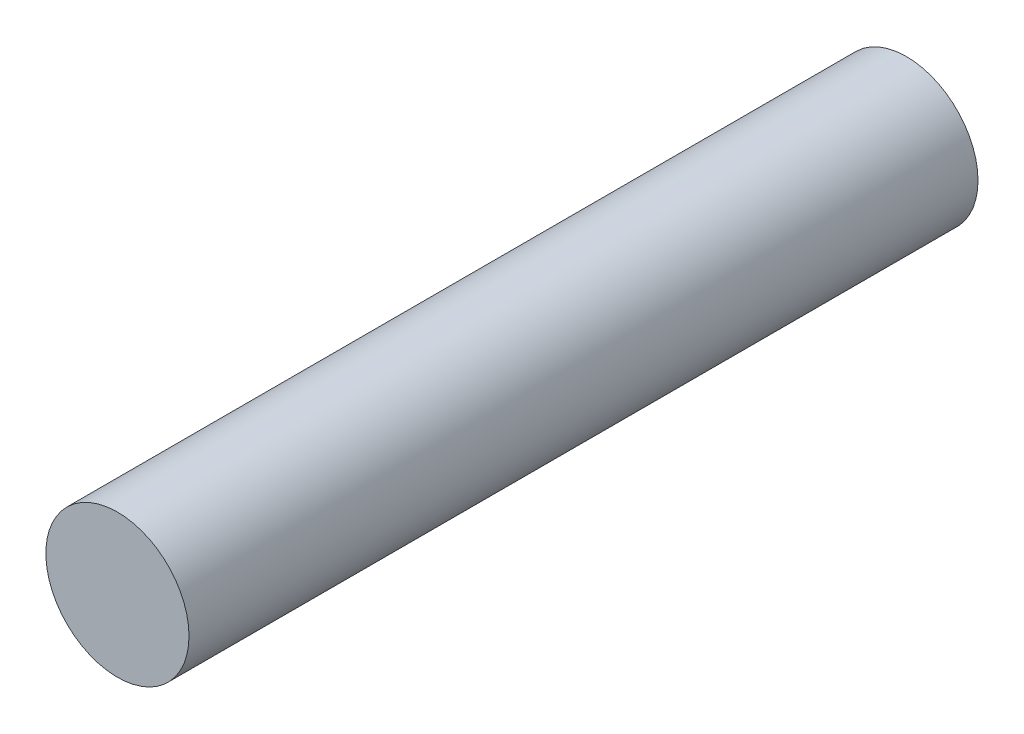
ISO-10303-21;
HEADER;
FILE_DESCRIPTION(('STEP AP214'),'2;1');
FILE_NAME('part.step','',(''),(''),'','','');
FILE_SCHEMA(('AUTOMOTIVE_DESIGN { 1 0 10303 214 1 1 1 1 }'));
ENDSEC;
DATA;
#1=APPLICATION_CONTEXT('core data for automotive mechanical design processes');
#2=APPLICATION_PROTOCOL_DEFINITION('international standard','automotive_design',2000,#1);
#3=PRODUCT_CONTEXT('',#1,'mechanical');
#4=PRODUCT('Part','Part','',(#3));
#5=PRODUCT_RELATED_PRODUCT_CATEGORY('part','',(#4));
#6=PRODUCT_DEFINITION_FORMATION('','',#4);
#7=PRODUCT_DEFINITION_CONTEXT('part definition',#1,'design');
#8=PRODUCT_DEFINITION('design','',#6,#7);
#9=PRODUCT_DEFINITION_SHAPE('','',#8);
#10=(LENGTH_UNIT() NAMED_UNIT(*) SI_UNIT(.MILLI.,.METRE.));
#11=(NAMED_UNIT(*) PLANE_ANGLE_UNIT() SI_UNIT($,.RADIAN.));
#12=(NAMED_UNIT(*) SI_UNIT($,.STERADIAN.) SOLID_ANGLE_UNIT());
#13=UNCERTAINTY_MEASURE_WITH_UNIT(LENGTH_MEASURE(1.E-05),#10,'distance_accuracy_value','');
#14=(GEOMETRIC_REPRESENTATION_CONTEXT(3) GLOBAL_UNCERTAINTY_ASSIGNED_CONTEXT((#13)) GLOBAL_UNIT_ASSIGNED_CONTEXT((#10,
#11,#12)) REPRESENTATION_CONTEXT('',''));
#15=CARTESIAN_POINT('',(0.,0.,0.));
#16=DIRECTION('',(0.,0.,1.));
#17=DIRECTION('',(1.,0.,0.));
#18=AXIS2_PLACEMENT_3D('',#15,#16,#17);
#19=CARTESIAN_POINT('',(0.,0.,35.));
#20=DIRECTION('',(0.,0.,-1.));
#21=DIRECTION('',(-1.,0.,0.));
#22=AXIS2_PLACEMENT_3D('',#19,#20,#21);
#23=CYLINDRICAL_SURFACE('',#22,6.35);
#24=CARTESIAN_POINT('',(0.,0.,35.));
#25=DIRECTION('',(0.,0.,1.));
#26=DIRECTION('',(1.,0.,0.));
#27=AXIS2_PLACEMENT_3D('',#24,#25,#26);
#28=CIRCLE('',#27,6.35);
#29=CARTESIAN_POINT('',(6.35,0.,35.));
#30=VERTEX_POINT('',#29);
#31=EDGE_CURVE('E10',#30,#30,#28,.T.);
#32=ORIENTED_EDGE('',*,*,#31,.F.);
#33=EDGE_LOOP('',(#32));
#34=FACE_BOUND('',#33,.T.);
#35=CARTESIAN_POINT('',(0.,0.,-35.));
#36=DIRECTION('',(0.,0.,1.));
#37=DIRECTION('',(1.,0.,0.));
#38=AXIS2_PLACEMENT_3D('',#35,#36,#37);
#39=CIRCLE('',#38,6.35);
#40=CARTESIAN_POINT('',(6.35,0.,-35.));
#41=VERTEX_POINT('',#40);
#42=EDGE_CURVE('E34',#41,#41,#39,.T.);
#43=ORIENTED_EDGE('',*,*,#42,.T.);
#44=EDGE_LOOP('',(#43));
#45=FACE_BOUND('',#44,.T.);
#46=ADVANCED_FACE('F31',(#34,#45),#23,.T.);
#47=CARTESIAN_POINT('',(0.,0.,35.));
#48=DIRECTION('',(0.,0.,1.));
#49=DIRECTION('',(1.,0.,0.));
#50=AXIS2_PLACEMENT_3D('',#47,#48,#49);
#51=PLANE('',#50);
#52=ORIENTED_EDGE('',*,*,#31,.T.);
#53=EDGE_LOOP('',(#52));
#54=FACE_BOUND('',#53,.T.);
#55=ADVANCED_FACE('F46',(#54),#51,.T.);
#56=CARTESIAN_POINT('',(0.,0.,-35.));
#57=DIRECTION('',(0.,0.,1.));
#58=DIRECTION('',(1.,0.,0.));
#59=AXIS2_PLACEMENT_3D('',#56,#57,#58);
#60=PLANE('',#59);
#61=ORIENTED_EDGE('',*,*,#42,.F.);
#62=EDGE_LOOP('',(#61));
#63=FACE_BOUND('',#62,.T.);
#64=ADVANCED_FACE('F44',(#63),#60,.F.);
#65=CLOSED_SHELL('',(#46,#55,#64));
#66=MANIFOLD_SOLID_BREP('B2',#65);
#67=ADVANCED_BREP_SHAPE_REPRESENTATION('',(#18,#66),#14);
#68=SHAPE_DEFINITION_REPRESENTATION(#9,#67);
ENDSEC;
END-ISO-10303-21;
